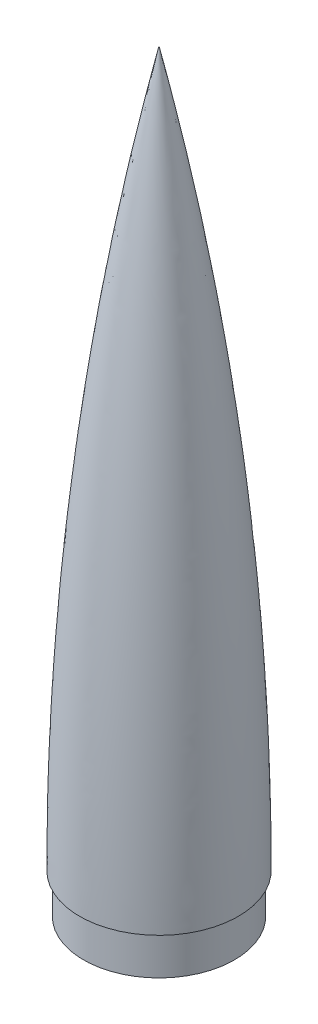
ISO-10303-21;
HEADER;
FILE_DESCRIPTION(('STEP AP214'),'2;1');
FILE_NAME('part.step','',(''),(''),'','','');
FILE_SCHEMA(('AUTOMOTIVE_DESIGN { 1 0 10303 214 1 1 1 1 }'));
ENDSEC;
DATA;
#1=APPLICATION_CONTEXT('core data for automotive mechanical design processes');
#2=APPLICATION_PROTOCOL_DEFINITION('international standard','automotive_design',2000,#1);
#3=PRODUCT_CONTEXT('',#1,'mechanical');
#4=PRODUCT('Part','Part','',(#3));
#5=PRODUCT_RELATED_PRODUCT_CATEGORY('part','',(#4));
#6=PRODUCT_DEFINITION_FORMATION('','',#4);
#7=PRODUCT_DEFINITION_CONTEXT('part definition',#1,'design');
#8=PRODUCT_DEFINITION('design','',#6,#7);
#9=PRODUCT_DEFINITION_SHAPE('','',#8);
#10=(LENGTH_UNIT() NAMED_UNIT(*) SI_UNIT(.MILLI.,.METRE.));
#11=(NAMED_UNIT(*) PLANE_ANGLE_UNIT() SI_UNIT($,.RADIAN.));
#12=(NAMED_UNIT(*) SI_UNIT($,.STERADIAN.) SOLID_ANGLE_UNIT());
#13=UNCERTAINTY_MEASURE_WITH_UNIT(LENGTH_MEASURE(1.E-05),#10,'distance_accuracy_value','');
#14=(GEOMETRIC_REPRESENTATION_CONTEXT(3) GLOBAL_UNCERTAINTY_ASSIGNED_CONTEXT((#13)) GLOBAL_UNIT_ASSIGNED_CONTEXT((#10,
#11,#12)) REPRESENTATION_CONTEXT('',''));
#15=CARTESIAN_POINT('',(0.,0.,0.));
#16=DIRECTION('',(0.,0.,1.));
#17=DIRECTION('',(1.,0.,0.));
#18=AXIS2_PLACEMENT_3D('',#15,#16,#17);
#19=CARTESIAN_POINT('',(0.,0.,1016.));
#20=DIRECTION('',(-1.,0.,0.));
#21=DIRECTION('',(0.,0.,-1.));
#22=AXIS2_PLACEMENT_3D('',#19,#20,#21);
#23=CIRCLE('',#22,1041.4);
#24=TRIMMED_CURVE('',#23,(PARAMETER_VALUE(-0.221314442347792)),
(PARAMETER_VALUE(0.221314442347792)),.T.,.PARAMETER.);
#25=CARTESIAN_POINT('',(0.,0.,0.));
#26=DIRECTION('',(0.,-1.,0.));
#27=AXIS1_PLACEMENT('',#25,#26);
#28=SURFACE_OF_REVOLUTION('',#24,#27);
#29=CARTESIAN_POINT('',(0.,0.,0.));
#30=DIRECTION('',(0.,-1.,0.));
#31=DIRECTION('',(0.,0.,-1.));
#32=AXIS2_PLACEMENT_3D('',#29,#30,#31);
#33=CIRCLE('',#32,25.4);
#34=CARTESIAN_POINT('',(0.,0.,-25.4));
#35=VERTEX_POINT('',#34);
#36=EDGE_CURVE('E56',#35,#35,#33,.T.);
#37=ORIENTED_EDGE('',*,*,#36,.F.);
#38=EDGE_LOOP('',(#37));
#39=FACE_BOUND('',#38,.T.);
#40=CARTESIAN_POINT('',(0.,228.6,0.));
#41=VERTEX_POINT('',#40);
#42=VERTEX_LOOP('',#41);
#43=FACE_BOUND('',#42,.T.);
#44=ADVANCED_FACE('F36',(#39,#43),#28,.T.);
#45=CARTESIAN_POINT('',(-24.1554,-12.7,0.));
#46=DIRECTION('',(0.,1.,0.));
#47=DIRECTION('',(0.,0.,1.));
#48=AXIS2_PLACEMENT_3D('',#45,#46,#47);
#49=PLANE('',#48);
#50=CARTESIAN_POINT('',(0.,-12.7,0.));
#51=DIRECTION('',(0.,-1.,0.));
#52=DIRECTION('',(0.,0.,-1.));
#53=AXIS2_PLACEMENT_3D('',#50,#51,#52);
#54=CIRCLE('',#53,24.1554);
#55=CARTESIAN_POINT('',(0.,-12.7,-24.1554));
#56=VERTEX_POINT('',#55);
#57=EDGE_CURVE('E11',#56,#56,#54,.T.);
#58=ORIENTED_EDGE('',*,*,#57,.T.);
#59=EDGE_LOOP('',(#58));
#60=FACE_BOUND('',#59,.T.);
#61=ADVANCED_FACE('F47',(#60),#49,.F.);
#62=CARTESIAN_POINT('',(0.,-12.7,0.));
#63=DIRECTION('',(0.,-1.,0.));
#64=DIRECTION('',(0.,0.,-1.));
#65=AXIS2_PLACEMENT_3D('',#62,#63,#64);
#66=CYLINDRICAL_SURFACE('',#65,24.1554);
#67=ORIENTED_EDGE('',*,*,#57,.F.);
#68=EDGE_LOOP('',(#67));
#69=FACE_BOUND('',#68,.T.);
#70=CARTESIAN_POINT('',(0.,0.,0.));
#71=DIRECTION('',(0.,-1.,0.));
#72=DIRECTION('',(0.,0.,-1.));
#73=AXIS2_PLACEMENT_3D('',#70,#71,#72);
#74=CIRCLE('',#73,24.1554);
#75=CARTESIAN_POINT('',(0.,0.,-24.1554));
#76=VERTEX_POINT('',#75);
#77=EDGE_CURVE('E43',#76,#76,#74,.T.);
#78=ORIENTED_EDGE('',*,*,#77,.T.);
#79=EDGE_LOOP('',(#78));
#80=FACE_BOUND('',#79,.T.);
#81=ADVANCED_FACE('F52',(#69,#80),#66,.T.);
#82=CARTESIAN_POINT('',(-25.4,0.,0.));
#83=DIRECTION('',(0.,1.,0.));
#84=DIRECTION('',(0.,0.,1.));
#85=AXIS2_PLACEMENT_3D('',#82,#83,#84);
#86=PLANE('',#85);
#87=ORIENTED_EDGE('',*,*,#77,.F.);
#88=EDGE_LOOP('',(#87));
#89=FACE_BOUND('',#88,.T.);
#90=ORIENTED_EDGE('',*,*,#36,.T.);
#91=EDGE_LOOP('',(#90));
#92=FACE_BOUND('',#91,.T.);
#93=ADVANCED_FACE('F67',(#89,#92),#86,.F.);
#94=CLOSED_SHELL('',(#44,#61,#81,#93));
#95=MANIFOLD_SOLID_BREP('B2',#94);
#96=ADVANCED_BREP_SHAPE_REPRESENTATION('',(#18,#95),#14);
#97=SHAPE_DEFINITION_REPRESENTATION(#9,#96);
ENDSEC;
END-ISO-10303-21;
